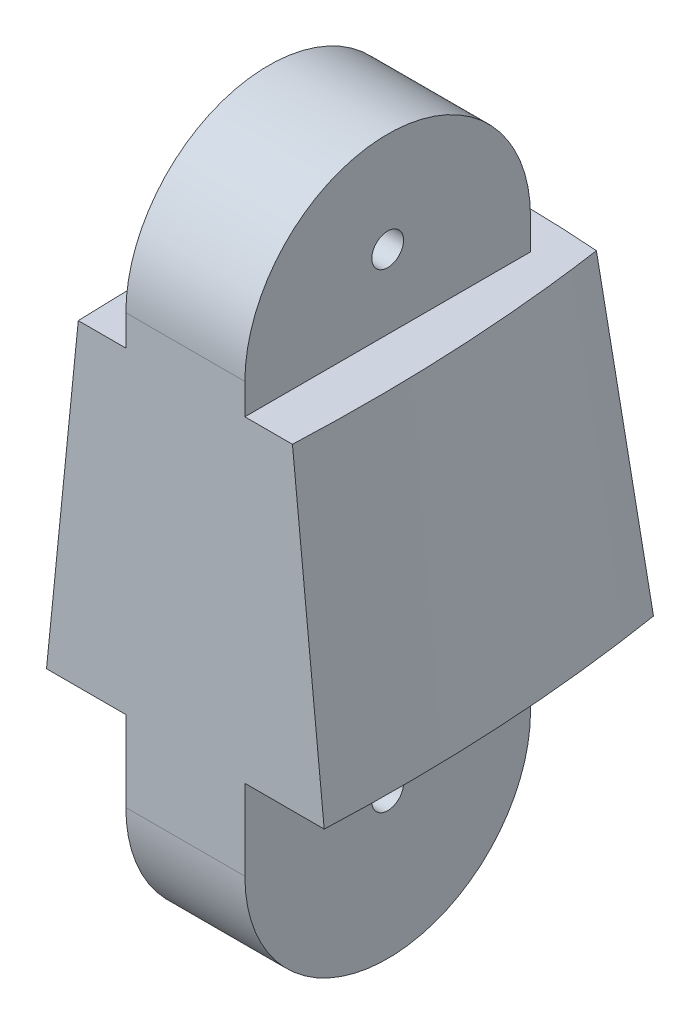
ISO-10303-21;
HEADER;
FILE_DESCRIPTION(('STEP AP214'),'2;1');
FILE_NAME('part.step','',(''),(''),'','','');
FILE_SCHEMA(('AUTOMOTIVE_DESIGN { 1 0 10303 214 1 1 1 1 }'));
ENDSEC;
DATA;
#1=APPLICATION_CONTEXT('core data for automotive mechanical design processes');
#2=APPLICATION_PROTOCOL_DEFINITION('international standard','automotive_design',2000,#1);
#3=PRODUCT_CONTEXT('',#1,'mechanical');
#4=PRODUCT('Part','Part','',(#3));
#5=PRODUCT_RELATED_PRODUCT_CATEGORY('part','',(#4));
#6=PRODUCT_DEFINITION_FORMATION('','',#4);
#7=PRODUCT_DEFINITION_CONTEXT('part definition',#1,'design');
#8=PRODUCT_DEFINITION('design','',#6,#7);
#9=PRODUCT_DEFINITION_SHAPE('','',#8);
#10=(LENGTH_UNIT() NAMED_UNIT(*) SI_UNIT(.MILLI.,.METRE.));
#11=(NAMED_UNIT(*) PLANE_ANGLE_UNIT() SI_UNIT($,.RADIAN.));
#12=(NAMED_UNIT(*) SI_UNIT($,.STERADIAN.) SOLID_ANGLE_UNIT());
#13=UNCERTAINTY_MEASURE_WITH_UNIT(LENGTH_MEASURE(1.E-05),#10,'distance_accuracy_value','');
#14=(GEOMETRIC_REPRESENTATION_CONTEXT(3) GLOBAL_UNCERTAINTY_ASSIGNED_CONTEXT((#13)) GLOBAL_UNIT_ASSIGNED_CONTEXT((#10,
#11,#12)) REPRESENTATION_CONTEXT('',''));
#15=CARTESIAN_POINT('',(0.,0.,0.));
#16=DIRECTION('',(0.,0.,1.));
#17=DIRECTION('',(1.,0.,0.));
#18=AXIS2_PLACEMENT_3D('',#15,#16,#17);
#19=CARTESIAN_POINT('',(0.,0.,-10.5150664920274));
#20=DIRECTION('',(0.,1.,0.));
#21=DIRECTION('',(0.,0.,1.));
#22=AXIS2_PLACEMENT_3D('',#19,#20,#21);
#23=PLANE('',#22);
#24=CARTESIAN_POINT('',(-8.75,0.,11.8461538461538));
#25=CARTESIAN_POINT('',(0.,0.,11.8461538461538));
#26=CARTESIAN_POINT('',(8.75,0.,11.8461538461538));
#27=B_SPLINE_CURVE_WITH_KNOTS('',2,(#24,#25,#26),.UNSPECIFIED.,.F.,.F.,(3,3),(0.,1.),.UNSPECIFIED.);
#28=CARTESIAN_POINT('',(3.75,0.,11.8461538461455));
#29=VERTEX_POINT('',#28);
#30=CARTESIAN_POINT('',(8.75,0.,11.8461538461538));
#31=VERTEX_POINT('',#30);
#32=EDGE_CURVE('E124',#29,#31,#27,.T.);
#33=ORIENTED_EDGE('',*,*,#32,.F.);
#34=DIRECTION('',(0.,0.,-1.));
#35=VECTOR('',#34,1.);
#36=CARTESIAN_POINT('',(3.75,0.,-10.5150664920274));
#37=LINE('',#36,#35);
#38=CARTESIAN_POINT('',(3.75,0.,-6.15384615384616));
#39=VERTEX_POINT('',#38);
#40=EDGE_CURVE('E138',#29,#39,#37,.T.);
#41=ORIENTED_EDGE('',*,*,#40,.T.);
#42=DIRECTION('',(1.,0.,0.));
#43=VECTOR('',#42,1.);
#44=CARTESIAN_POINT('',(0.,0.,-6.15384615384616));
#45=LINE('',#44,#43);
#46=CARTESIAN_POINT('',(-3.75,0.,-6.15384615384616));
#47=VERTEX_POINT('',#46);
#48=EDGE_CURVE('E570',#47,#39,#45,.T.);
#49=ORIENTED_EDGE('',*,*,#48,.F.);
#50=DIRECTION('',(0.,0.,-1.));
#51=VECTOR('',#50,1.);
#52=CARTESIAN_POINT('',(-3.75,0.,-10.5150664920274));
#53=LINE('',#52,#51);
#54=CARTESIAN_POINT('',(-3.75,0.,11.846153846133));
#55=VERTEX_POINT('',#54);
#56=EDGE_CURVE('E241',#55,#47,#53,.T.);
#57=ORIENTED_EDGE('',*,*,#56,.F.);
#58=CARTESIAN_POINT('',(-8.75,0.,11.8461538461538));
#59=VERTEX_POINT('',#58);
#60=EDGE_CURVE('E298',#59,#55,#27,.T.);
#61=ORIENTED_EDGE('',*,*,#60,.F.);
#62=CARTESIAN_POINT('',(-7.5,0.,-10.1538461538461));
#63=CARTESIAN_POINT('',(-9.2203932258797,0.,0.545261229815072));
#64=CARTESIAN_POINT('',(-8.75,0.,11.8461538461538));
#65=B_SPLINE_CURVE_WITH_KNOTS('',2,(#62,#63,#64),.UNSPECIFIED.,.F.,.F.,(3,3),(0.,1.),.UNSPECIFIED.);
#66=CARTESIAN_POINT('',(-7.5,0.,-10.1538461538461));
#67=VERTEX_POINT('',#66);
#68=EDGE_CURVE('E130',#67,#59,#65,.T.);
#69=ORIENTED_EDGE('',*,*,#68,.F.);
#70=CARTESIAN_POINT('',(7.5,0.,-10.1538461538461));
#71=CARTESIAN_POINT('',(0.,0.,-10.8762868302087));
#72=CARTESIAN_POINT('',(-7.5,0.,-10.1538461538461));
#73=B_SPLINE_CURVE_WITH_KNOTS('',2,(#70,#71,#72),.UNSPECIFIED.,.F.,.F.,(3,3),(0.,1.),.UNSPECIFIED.);
#74=CARTESIAN_POINT('',(7.5,0.,-10.1538461538461));
#75=VERTEX_POINT('',#74);
#76=EDGE_CURVE('E372',#75,#67,#73,.T.);
#77=ORIENTED_EDGE('',*,*,#76,.F.);
#78=CARTESIAN_POINT('',(8.75,0.,11.8461538461538));
#79=CARTESIAN_POINT('',(9.22039322587971,0.,0.54526122981507));
#80=CARTESIAN_POINT('',(7.5,0.,-10.1538461538461));
#81=B_SPLINE_CURVE_WITH_KNOTS('',2,(#78,#79,#80),.UNSPECIFIED.,.F.,.F.,(3,3),(0.,1.),.UNSPECIFIED.);
#82=EDGE_CURVE('E365',#31,#75,#81,.T.);
#83=ORIENTED_EDGE('',*,*,#82,.F.);
#84=EDGE_LOOP('',(#33,#41,#49,#57,#61,#69,#77,#83));
#85=FACE_BOUND('',#84,.T.);
#86=ADVANCED_FACE('F119',(#85),#23,.F.);
#87=CARTESIAN_POINT('',(-7.17393360621346,20.,-45.1690215571504));
#88=DIRECTION('',(0.,-1.,0.));
#89=DIRECTION('',(0.,0.,-1.));
#90=AXIS2_PLACEMENT_3D('',#87,#88,#89);
#91=PLANE('',#90);
#92=DIRECTION('',(-1.,0.,0.));
#93=VECTOR('',#92,1.);
#94=CARTESIAN_POINT('',(-7.17393360621346,20.,-6.15384615384615));
#95=LINE('',#94,#93);
#96=CARTESIAN_POINT('',(3.75,20.,-6.15384615384615));
#97=VERTEX_POINT('',#96);
#98=CARTESIAN_POINT('',(-3.75,20.,-6.15384615384616));
#99=VERTEX_POINT('',#98);
#100=EDGE_CURVE('E13',#97,#99,#95,.T.);
#101=ORIENTED_EDGE('',*,*,#100,.F.);
#102=DIRECTION('',(0.,0.,1.));
#103=VECTOR('',#102,1.);
#104=CARTESIAN_POINT('',(3.75,20.,-45.1690215571504));
#105=LINE('',#104,#103);
#106=CARTESIAN_POINT('',(3.75,20.,11.8461538461488));
#107=VERTEX_POINT('',#106);
#108=EDGE_CURVE('E280',#97,#107,#105,.T.);
#109=ORIENTED_EDGE('',*,*,#108,.T.);
#110=CARTESIAN_POINT('',(-8.75,20.,11.8461538461538));
#111=CARTESIAN_POINT('',(0.,20.,11.8461538461538));
#112=CARTESIAN_POINT('',(8.75,20.,11.8461538461538));
#113=B_SPLINE_CURVE_WITH_KNOTS('',2,(#110,#111,#112),.UNSPECIFIED.,.F.,.F.,(3,3),(0.,1.),.UNSPECIFIED.);
#114=CARTESIAN_POINT('',(6.74823833872554,20.,11.8461538461538));
#115=VERTEX_POINT('',#114);
#116=EDGE_CURVE('E218',#107,#115,#113,.T.);
#117=ORIENTED_EDGE('',*,*,#116,.T.);
#118=CARTESIAN_POINT('',(-2468.25612295644,20.,1686.28492565215));
#119=CARTESIAN_POINT('',(1169.14710624481,20.,-397.023938367836));
#120=CARTESIAN_POINT('',(621.959547383673,20.,-173.439589989387));
#121=CARTESIAN_POINT('',(-2962.45530677871,20.,-336.246513037687));
#122=B_SPLINE_CURVE_WITH_KNOTS('',3,(#118,#119,#120,#121),.UNSPECIFIED.,.F.,.F.,(4,4),
(-40.4829444596884,36.500435862339),.UNSPECIFIED.);
#123=CARTESIAN_POINT('',(5.76096322759435,20.,-8.29632819805975));
#124=VERTEX_POINT('',#123);
#125=EDGE_CURVE('E418',#115,#124,#122,.T.);
#126=ORIENTED_EDGE('',*,*,#125,.T.);
#127=CARTESIAN_POINT('',(5.76096322759391,20.,-8.29632819805979));
#128=CARTESIAN_POINT('',(1.91974228306342,20.,-8.58801218824814));
#129=CARTESIAN_POINT('',(-1.91974228306213,20.,-8.58801218824821));
#130=CARTESIAN_POINT('',(-5.76096322759262,20.,-8.29632819805992));
#131=B_SPLINE_CURVE_WITH_KNOTS('',3,(#127,#128,#129,#130),.UNSPECIFIED.,.F.,.F.,(4,4),(0.,1.),.UNSPECIFIED.);
#132=CARTESIAN_POINT('',(-5.760963227599,20.,-8.29632819803111));
#133=VERTEX_POINT('',#132);
#134=EDGE_CURVE('E435',#124,#133,#131,.T.);
#135=ORIENTED_EDGE('',*,*,#134,.T.);
#136=CARTESIAN_POINT('',(2962.38230705654,20.,-336.24319776774));
#137=CARTESIAN_POINT('',(-621.965937953665,20.,-173.442672386384));
#138=CARTESIAN_POINT('',(-1169.12209588683,20.,-397.009666203134));
#139=CARTESIAN_POINT('',(2468.25296066469,20.,1686.28311478494));
#140=B_SPLINE_CURVE_WITH_KNOTS('',3,(#136,#137,#138,#139),.UNSPECIFIED.,.F.,.F.,(4,4),
(-35.5004135536024,41.4824218446381),.UNSPECIFIED.);
#141=CARTESIAN_POINT('',(-6.74823833872717,20.,11.846153846109));
#142=VERTEX_POINT('',#141);
#143=EDGE_CURVE('E427',#133,#142,#140,.T.);
#144=ORIENTED_EDGE('',*,*,#143,.T.);
#145=CARTESIAN_POINT('',(-3.75,20.,11.8461538461538));
#146=VERTEX_POINT('',#145);
#147=EDGE_CURVE('E391',#142,#146,#113,.T.);
#148=ORIENTED_EDGE('',*,*,#147,.T.);
#149=DIRECTION('',(0.,0.,1.));
#150=VECTOR('',#149,1.);
#151=CARTESIAN_POINT('',(-3.75,20.,-45.1690215571504));
#152=LINE('',#151,#150);
#153=EDGE_CURVE('E237',#99,#146,#152,.T.);
#154=ORIENTED_EDGE('',*,*,#153,.F.);
#155=EDGE_LOOP('',(#101,#109,#117,#126,#135,#144,#148,#154));
#156=FACE_BOUND('',#155,.T.);
#157=ADVANCED_FACE('F333',(#156),#91,.F.);
#158=CARTESIAN_POINT('',(6.74823833872554,20.,11.8461538461538));
#159=DIRECTION('',(-3.33346653535284E-12,-3.33640275480538E-13,1.));
#160=DIRECTION('',(-1.,0.,-3.33346653535284E-12));
#161=AXIS2_PLACEMENT_3D('',#158,#159,#160);
#162=PLANE('',#161);
#163=ORIENTED_EDGE('',*,*,#116,.F.);
#164=DIRECTION('',(0.,-1.,0.));
#165=VECTOR('',#164,1.);
#166=CARTESIAN_POINT('',(3.75,21.9297869844279,11.8461538461538));
#167=LINE('',#166,#165);
#168=CARTESIAN_POINT('',(3.75,21.9297869844279,11.8461538461538));
#169=VERTEX_POINT('',#168);
#170=EDGE_CURVE('E211',#169,#107,#167,.T.);
#171=ORIENTED_EDGE('',*,*,#170,.F.);
#172=DIRECTION('',(-1.,0.,0.));
#173=VECTOR('',#172,1.);
#174=CARTESIAN_POINT('',(3.75,21.9297869844279,11.8461538461538));
#175=LINE('',#174,#173);
#176=CARTESIAN_POINT('',(-3.75,21.9297869844279,11.8461538461538));
#177=VERTEX_POINT('',#176);
#178=EDGE_CURVE('E215',#169,#177,#175,.T.);
#179=ORIENTED_EDGE('',*,*,#178,.T.);
#180=DIRECTION('',(0.,-1.,0.));
#181=VECTOR('',#180,1.);
#182=CARTESIAN_POINT('',(-3.75,21.9297869844279,11.8461538461538));
#183=LINE('',#182,#181);
#184=EDGE_CURVE('E248',#177,#146,#183,.T.);
#185=ORIENTED_EDGE('',*,*,#184,.T.);
#186=ORIENTED_EDGE('',*,*,#147,.F.);
#187=CARTESIAN_POINT('',(-6.74823833872709,20.,11.8461538461088));
#188=CARTESIAN_POINT('',(-7.41549222581806,13.3333333333333,11.8461538461238));
#189=CARTESIAN_POINT('',(-8.08274611290903,6.66666666666666,11.8461538461388));
#190=CARTESIAN_POINT('',(-8.75,0.,11.8461538461538));
#191=B_SPLINE_CURVE_WITH_KNOTS('',3,(#187,#188,#189,#190),.UNSPECIFIED.,.F.,.F.,(4,4),(0.,1.),.UNSPECIFIED.);
#192=EDGE_CURVE('E542',#142,#59,#191,.T.);
#193=ORIENTED_EDGE('',*,*,#192,.T.);
#194=ORIENTED_EDGE('',*,*,#60,.T.);
#195=CARTESIAN_POINT('',(-3.75,-5.07021301557208,11.8461538461538));
#196=VERTEX_POINT('',#195);
#197=EDGE_CURVE('E252',#55,#196,#183,.T.);
#198=ORIENTED_EDGE('',*,*,#197,.T.);
#199=DIRECTION('',(-1.,0.,0.));
#200=VECTOR('',#199,1.);
#201=CARTESIAN_POINT('',(3.75,-5.07021301557208,11.8461538461538));
#202=LINE('',#201,#200);
#203=CARTESIAN_POINT('',(3.75,-5.07021301557208,11.8461538461538));
#204=VERTEX_POINT('',#203);
#205=EDGE_CURVE('E238',#204,#196,#202,.T.);
#206=ORIENTED_EDGE('',*,*,#205,.F.);
#207=EDGE_CURVE('E222',#29,#204,#167,.T.);
#208=ORIENTED_EDGE('',*,*,#207,.F.);
#209=ORIENTED_EDGE('',*,*,#32,.T.);
#210=CARTESIAN_POINT('',(6.74823833872554,20.,11.8461538461538));
#211=CARTESIAN_POINT('',(7.41549222581703,13.3333333333333,11.8461538461538));
#212=CARTESIAN_POINT('',(8.08274611290851,6.66666666666667,11.8461538461538));
#213=CARTESIAN_POINT('',(8.75,0.,11.8461538461538));
#214=B_SPLINE_CURVE_WITH_KNOTS('',3,(#210,#211,#212,#213),.UNSPECIFIED.,.F.,.F.,(4,4),(0.,1.),.UNSPECIFIED.);
#215=EDGE_CURVE('E539',#115,#31,#214,.T.);
#216=ORIENTED_EDGE('',*,*,#215,.F.);
#217=EDGE_LOOP('',(#163,#171,#179,#185,#186,#193,#194,#198,#206,#208,#209,#216));
#218=FACE_BOUND('',#217,.T.);
#219=ADVANCED_FACE('F121',(#218),#162,.T.);
#220=CARTESIAN_POINT('',(5.76096322759435,20.,-8.29632819805975));
#221=CARTESIAN_POINT('',(6.34064215172957,13.3333333333333,-8.91550084998855));
#222=CARTESIAN_POINT('',(6.92032107586478,6.66666666666667,-9.53467350191735));
#223=CARTESIAN_POINT('',(7.5,0.,-10.1538461538461));
#224=CARTESIAN_POINT('',(5.99826518480455,20.,-6.66208337973978));
#225=CARTESIAN_POINT('',(6.59442085797413,13.3333333333333,-7.23160944979406));
#226=CARTESIAN_POINT('',(7.19057653114371,6.66666666666667,-7.80113551984834));
#227=CARTESIAN_POINT('',(7.78673220431328,0.,-8.37066158990261));
#228=CARTESIAN_POINT('',(6.39546064325868,20.,-3.37169502818409));
#229=CARTESIAN_POINT('',(7.01994504354463,13.3333333333333,-3.84086937789628));
#230=CARTESIAN_POINT('',(7.64442944383058,6.66666666666666,-4.31004372760846));
#231=CARTESIAN_POINT('',(8.26891384411653,0.,-4.77921807732064));
#232=CARTESIAN_POINT('',(6.75878982877219,20.,1.63014380637131));
#233=CARTESIAN_POINT('',(7.41197255163197,13.3333333333333,1.31448598612654));
#234=CARTESIAN_POINT('',(8.06515527449175,6.66666666666667,0.998828165881778));
#235=CARTESIAN_POINT('',(8.71833799735153,0.,0.683170345637011));
#236=CARTESIAN_POINT('',(6.88941637784931,20.,6.69879911062324));
#237=CARTESIAN_POINT('',(7.55758219993838,13.3333333333333,6.53946004797527));
#238=CARTESIAN_POINT('',(8.22574802202746,6.66666666666667,6.38012098532731));
#239=CARTESIAN_POINT('',(8.89391384411653,0.,6.22078192267935));
#240=CARTESIAN_POINT('',(6.82120656343057,20.,10.1228204015719));
#241=CARTESIAN_POINT('',(7.49027066594703,13.3333333333333,10.0694375155249));
#242=CARTESIAN_POINT('',(8.15933476846349,6.66666666666667,10.0160546294778));
#243=CARTESIAN_POINT('',(8.82839887097995,0.,9.96267174343071));
#244=CARTESIAN_POINT('',(6.74823833872554,20.,11.8461538461538));
#245=CARTESIAN_POINT('',(7.41549222581703,13.3333333333333,11.8461538461538));
#246=CARTESIAN_POINT('',(8.08274611290851,6.66666666666667,11.8461538461538));
#247=CARTESIAN_POINT('',(8.75,0.,11.8461538461538));
#248=B_SPLINE_SURFACE_WITH_KNOTS('',3,3,((#220,#221,#222,#223),(#224,#225,#226,#227),(#228,#229,
#230,#231),(#232,#233,#234,#235),(#236,#237,#238,#239),(#240,#241,#242,#243),(#244,#245,#246,
#247)),.UNSPECIFIED.,.F.,.F.,.F.,(4,1,1,1,4),(4,4),(0.484420366691908,0.558995874922004,
0.6335713831521,0.708146891382196,0.782722399612291),(0.,1.),.UNSPECIFIED.);
#249=CARTESIAN_POINT('',(5.76096322759435,20.,-8.29632819805975));
#250=CARTESIAN_POINT('',(6.34064215172957,13.3333333333333,-8.91550084998855));
#251=CARTESIAN_POINT('',(6.92032107586478,6.66666666666667,-9.53467350191735));
#252=CARTESIAN_POINT('',(7.5,0.,-10.1538461538461));
#253=B_SPLINE_CURVE_WITH_KNOTS('',3,(#249,#250,#251,#252),.UNSPECIFIED.,.F.,.F.,(4,4),(0.,1.),.UNSPECIFIED.);
#254=EDGE_CURVE('E538',#124,#75,#253,.T.);
#255=ORIENTED_EDGE('',*,*,#125,.F.);
#256=ORIENTED_EDGE('',*,*,#215,.T.);
#257=ORIENTED_EDGE('',*,*,#82,.T.);
#258=ORIENTED_EDGE('',*,*,#254,.F.);
#259=EDGE_LOOP('',(#255,#256,#257,#258));
#260=FACE_BOUND('',#259,.T.);
#261=ADVANCED_FACE('F340',(#260),#248,.T.);
#262=CARTESIAN_POINT('',(-5.76096322759262,20.,-8.29632819805992));
#263=CARTESIAN_POINT('',(-6.34064215172841,13.3333333333333,-8.91550084998867));
#264=CARTESIAN_POINT('',(-6.92032107586421,6.66666666666667,-9.53467350191741));
#265=CARTESIAN_POINT('',(-7.5,0.,-10.1538461538461));
#266=CARTESIAN_POINT('',(-4.80065799146,20.,-8.369249195607));
#267=CARTESIAN_POINT('',(-5.28377199430666,13.3333333333333,-9.00425044148463));
#268=CARTESIAN_POINT('',(-5.76688599715333,6.66666666666667,-9.63925168736227));
#269=CARTESIAN_POINT('',(-6.25,0.,-10.2742529332399));
#270=CARTESIAN_POINT('',(-2.88026456649537,20.,-8.47863069192761));
#271=CARTESIAN_POINT('',(-3.17017637766358,13.3333333333333,-9.13737482872859));
#272=CARTESIAN_POINT('',(-3.46008818883179,6.66666666666666,-9.79611896552958));
#273=CARTESIAN_POINT('',(-3.75,0.,-10.4548631023306));
#274=CARTESIAN_POINT('',(6.46618175670355E-13,20.,-8.53332144008785));
#275=CARTESIAN_POINT('',(4.30211422042248E-13,13.3333333333333,-9.20393702235052));
#276=CARTESIAN_POINT('',(2.13804668414141E-13,6.66666666666667,-9.87455260461319));
#277=CARTESIAN_POINT('',(0.,0.,-10.5451681868759));
#278=CARTESIAN_POINT('',(2.88026456649667,20.,-8.47863069192752));
#279=CARTESIAN_POINT('',(3.17017637766444,13.3333333333333,-9.13737482872854));
#280=CARTESIAN_POINT('',(3.46008818883222,6.66666666666666,-9.79611896552955));
#281=CARTESIAN_POINT('',(3.75,0.,-10.4548631023306));
#282=CARTESIAN_POINT('',(4.80065799146129,20.,-8.36924919560688));
#283=CARTESIAN_POINT('',(5.28377199430753,13.3333333333333,-9.00425044148455));
#284=CARTESIAN_POINT('',(5.76688599715377,6.66666666666667,-9.63925168736223));
#285=CARTESIAN_POINT('',(6.25,0.,-10.2742529332399));
#286=CARTESIAN_POINT('',(5.76096322759435,20.,-8.29632819805975));
#287=CARTESIAN_POINT('',(6.34064215172957,13.3333333333333,-8.91550084998855));
#288=CARTESIAN_POINT('',(6.92032107586478,6.66666666666667,-9.53467350191735));
#289=CARTESIAN_POINT('',(7.5,0.,-10.1538461538461));
#290=B_SPLINE_SURFACE_WITH_KNOTS('',3,3,((#262,#263,#264,#265),(#266,#267,#268,#269),(#270,#271,
#272,#273),(#274,#275,#276,#277),(#278,#279,#280,#281),(#282,#283,#284,#285),(#286,#287,#288,
#289)),.UNSPECIFIED.,.F.,.F.,.F.,(4,1,1,1,4),(4,4),(0.298302032919818,0.344831616362841,
0.391361199805863,0.437890783248886,0.484420366691908),(0.,1.),.UNSPECIFIED.);
#291=CARTESIAN_POINT('',(-5.76096322759262,20.,-8.29632819805992));
#292=CARTESIAN_POINT('',(-6.34064215172841,13.3333333333333,-8.91550084998867));
#293=CARTESIAN_POINT('',(-6.92032107586421,6.66666666666667,-9.53467350191741));
#294=CARTESIAN_POINT('',(-7.5,0.,-10.1538461538461));
#295=B_SPLINE_CURVE_WITH_KNOTS('',3,(#291,#292,#293,#294),.UNSPECIFIED.,.F.,.F.,(4,4),(0.,1.),.UNSPECIFIED.);
#296=EDGE_CURVE('E434',#133,#67,#295,.T.);
#297=ORIENTED_EDGE('',*,*,#134,.F.);
#298=ORIENTED_EDGE('',*,*,#254,.T.);
#299=ORIENTED_EDGE('',*,*,#76,.T.);
#300=ORIENTED_EDGE('',*,*,#296,.F.);
#301=EDGE_LOOP('',(#297,#298,#299,#300));
#302=FACE_BOUND('',#301,.T.);
#303=ADVANCED_FACE('F496',(#302),#290,.T.);
#304=CARTESIAN_POINT('',(-6.74823833872709,20.,11.8461538461088));
#305=CARTESIAN_POINT('',(-7.41549222581806,13.3333333333333,11.8461538461238));
#306=CARTESIAN_POINT('',(-8.08274611290903,6.66666666666666,11.8461538461388));
#307=CARTESIAN_POINT('',(-8.75,0.,11.8461538461538));
#308=CARTESIAN_POINT('',(-6.82120656343122,20.,10.1228204015331));
#309=CARTESIAN_POINT('',(-7.49027066594746,13.3333333333333,10.0694375154989));
#310=CARTESIAN_POINT('',(-8.15933476846371,6.66666666666666,10.0160546294648));
#311=CARTESIAN_POINT('',(-8.82839887097995,0.,9.96267174343071));
#312=CARTESIAN_POINT('',(-6.88941637784881,20.,6.69879911059696));
#313=CARTESIAN_POINT('',(-7.55758219993804,13.3333333333333,6.53946004795776));
#314=CARTESIAN_POINT('',(-8.22574802202728,6.66666666666667,6.38012098531856));
#315=CARTESIAN_POINT('',(-8.89391384411652,0.,6.22078192267936));
#316=CARTESIAN_POINT('',(-6.75878982877174,20.,1.63014380636403));
#317=CARTESIAN_POINT('',(-7.41197255163167,13.3333333333333,1.31448598612169));
#318=CARTESIAN_POINT('',(-8.0651552744916,6.66666666666667,0.998828165879351));
#319=CARTESIAN_POINT('',(-8.71833799735154,0.,0.683170345637012));
#320=CARTESIAN_POINT('',(-6.3954606432599,20.,-3.37169502817285));
#321=CARTESIAN_POINT('',(-7.01994504354544,13.3333333333333,-3.84086937788878));
#322=CARTESIAN_POINT('',(-7.64442944383098,6.66666666666666,-4.31004372760471));
#323=CARTESIAN_POINT('',(-8.26891384411652,0.,-4.77921807732064));
#324=CARTESIAN_POINT('',(-5.99826518480786,20.,-6.66208337971686));
#325=CARTESIAN_POINT('',(-6.59442085797633,13.3333333333333,-7.23160944977878));
#326=CARTESIAN_POINT('',(-7.19057653114481,6.66666666666667,-7.80113551984069));
#327=CARTESIAN_POINT('',(-7.78673220431328,0.,-8.37066158990261));
#328=CARTESIAN_POINT('',(-5.76096322759262,20.,-8.29632819805992));
#329=CARTESIAN_POINT('',(-6.34064215172841,13.3333333333333,-8.91550084998867));
#330=CARTESIAN_POINT('',(-6.92032107586421,6.66666666666667,-9.53467350191741));
#331=CARTESIAN_POINT('',(-7.5,0.,-10.1538461538461));
#332=B_SPLINE_SURFACE_WITH_KNOTS('',3,3,((#304,#305,#306,#307),(#308,#309,#310,#311),(#312,#313,
#314,#315),(#316,#317,#318,#319),(#320,#321,#322,#323),(#324,#325,#326,#327),(#328,#329,#330,
#331)),.UNSPECIFIED.,.F.,.F.,.F.,(4,1,1,1,4),(4,4),(0.,0.0745755082299546,0.149151016459909,
0.223726524689864,0.298302032919818),(0.,1.),.UNSPECIFIED.);
#333=ORIENTED_EDGE('',*,*,#143,.F.);
#334=ORIENTED_EDGE('',*,*,#296,.T.);
#335=ORIENTED_EDGE('',*,*,#68,.T.);
#336=ORIENTED_EDGE('',*,*,#192,.F.);
#337=EDGE_LOOP('',(#333,#334,#335,#336));
#338=FACE_BOUND('',#337,.T.);
#339=ADVANCED_FACE('F488',(#338),#332,.T.);
#340=CARTESIAN_POINT('',(3.75,21.9297869844279,2.84615384615384));
#341=DIRECTION('',(-1.,0.,0.));
#342=DIRECTION('',(0.,0.,1.));
#343=AXIS2_PLACEMENT_3D('',#340,#341,#342);
#344=CYLINDRICAL_SURFACE('',#343,8.99999999999999);
#345=CARTESIAN_POINT('',(-3.75,21.9297869844279,2.84615384615384));
#346=DIRECTION('',(1.,0.,0.));
#347=DIRECTION('',(0.,0.,-1.));
#348=AXIS2_PLACEMENT_3D('',#345,#346,#347);
#349=CIRCLE('',#348,8.99999999999999);
#350=CARTESIAN_POINT('',(-3.75,21.9297869844279,-6.15384615384615));
#351=VERTEX_POINT('',#350);
#352=EDGE_CURVE('E236',#351,#177,#349,.T.);
#353=ORIENTED_EDGE('',*,*,#352,.T.);
#354=ORIENTED_EDGE('',*,*,#178,.F.);
#355=CARTESIAN_POINT('',(3.75,21.9297869844279,2.84615384615384));
#356=DIRECTION('',(1.,0.,0.));
#357=DIRECTION('',(0.,0.,-1.));
#358=AXIS2_PLACEMENT_3D('',#355,#356,#357);
#359=CIRCLE('',#358,8.99999999999999);
#360=CARTESIAN_POINT('',(3.75,21.9297869844279,-6.15384615384615));
#361=VERTEX_POINT('',#360);
#362=EDGE_CURVE('E225',#361,#169,#359,.T.);
#363=ORIENTED_EDGE('',*,*,#362,.F.);
#364=DIRECTION('',(-1.,0.,0.));
#365=VECTOR('',#364,1.);
#366=CARTESIAN_POINT('',(3.75,21.9297869844279,-6.15384615384615));
#367=LINE('',#366,#365);
#368=EDGE_CURVE('E262',#361,#351,#367,.T.);
#369=ORIENTED_EDGE('',*,*,#368,.T.);
#370=EDGE_LOOP('',(#353,#354,#363,#369));
#371=FACE_BOUND('',#370,.T.);
#372=ADVANCED_FACE('F234',(#371),#344,.T.);
#373=CARTESIAN_POINT('',(-3.75,21.9297869844279,2.84615384615384));
#374=DIRECTION('',(1.,0.,0.));
#375=DIRECTION('',(0.,0.,-1.));
#376=AXIS2_PLACEMENT_3D('',#373,#374,#375);
#377=PLANE('',#376);
#378=CARTESIAN_POINT('',(-3.75,24.6403128220649,2.84615384615385));
#379=DIRECTION('',(1.,0.,0.));
#380=DIRECTION('',(0.,0.,-1.));
#381=AXIS2_PLACEMENT_3D('',#378,#379,#380);
#382=CIRCLE('',#381,0.999999999999999);
#383=CARTESIAN_POINT('',(-3.75,24.6403128220649,1.84615384615385));
#384=VERTEX_POINT('',#383);
#385=EDGE_CURVE('E306',#384,#384,#382,.T.);
#386=ORIENTED_EDGE('',*,*,#385,.T.);
#387=EDGE_LOOP('',(#386));
#388=FACE_BOUND('',#387,.T.);
#389=DIRECTION('',(0.,1.,0.));
#390=VECTOR('',#389,1.);
#391=CARTESIAN_POINT('',(-3.75,21.9297869844279,-6.15384615384615));
#392=LINE('',#391,#390);
#393=EDGE_CURVE('E259',#99,#351,#392,.T.);
#394=ORIENTED_EDGE('',*,*,#393,.F.);
#395=ORIENTED_EDGE('',*,*,#153,.T.);
#396=ORIENTED_EDGE('',*,*,#184,.F.);
#397=ORIENTED_EDGE('',*,*,#352,.F.);
#398=EDGE_LOOP('',(#394,#395,#396,#397));
#399=FACE_BOUND('',#398,.T.);
#400=ADVANCED_FACE('F319',(#388,#399),#377,.F.);
#401=CARTESIAN_POINT('',(3.75,21.9297869844279,2.84615384615384));
#402=DIRECTION('',(1.,0.,0.));
#403=DIRECTION('',(0.,0.,-1.));
#404=AXIS2_PLACEMENT_3D('',#401,#402,#403);
#405=PLANE('',#404);
#406=CARTESIAN_POINT('',(3.75,24.6403128220649,2.84615384615385));
#407=DIRECTION('',(1.,0.,0.));
#408=DIRECTION('',(0.,0.,-1.));
#409=AXIS2_PLACEMENT_3D('',#406,#407,#408);
#410=CIRCLE('',#409,1.);
#411=CARTESIAN_POINT('',(3.75,24.6403128220649,1.84615384615384));
#412=VERTEX_POINT('',#411);
#413=EDGE_CURVE('E311',#412,#412,#410,.T.);
#414=ORIENTED_EDGE('',*,*,#413,.F.);
#415=EDGE_LOOP('',(#414));
#416=FACE_BOUND('',#415,.T.);
#417=ORIENTED_EDGE('',*,*,#108,.F.);
#418=DIRECTION('',(0.,1.,0.));
#419=VECTOR('',#418,1.);
#420=CARTESIAN_POINT('',(3.75,21.9297869844279,-6.15384615384615));
#421=LINE('',#420,#419);
#422=EDGE_CURVE('E228',#97,#361,#421,.T.);
#423=ORIENTED_EDGE('',*,*,#422,.T.);
#424=ORIENTED_EDGE('',*,*,#362,.T.);
#425=ORIENTED_EDGE('',*,*,#170,.T.);
#426=EDGE_LOOP('',(#417,#423,#424,#425));
#427=FACE_BOUND('',#426,.T.);
#428=ADVANCED_FACE('F226',(#416,#427),#405,.T.);
#429=CARTESIAN_POINT('',(3.75,21.9297869844279,-6.15384615384615));
#430=DIRECTION('',(0.,0.,1.));
#431=DIRECTION('',(0.,-1.,0.));
#432=AXIS2_PLACEMENT_3D('',#429,#430,#431);
#433=PLANE('',#432);
#434=ORIENTED_EDGE('',*,*,#422,.F.);
#435=ORIENTED_EDGE('',*,*,#100,.T.);
#436=ORIENTED_EDGE('',*,*,#393,.T.);
#437=ORIENTED_EDGE('',*,*,#368,.F.);
#438=EDGE_LOOP('',(#434,#435,#436,#437));
#439=FACE_BOUND('',#438,.T.);
#440=ADVANCED_FACE('F318',(#439),#433,.F.);
#441=CARTESIAN_POINT('',(-3.75,-5.07021301557208,-6.15384615384616));
#442=VERTEX_POINT('',#441);
#443=EDGE_CURVE('E232',#442,#47,#392,.T.);
#444=ORIENTED_EDGE('',*,*,#443,.T.);
#445=ORIENTED_EDGE('',*,*,#48,.T.);
#446=CARTESIAN_POINT('',(3.75,-5.07021301557208,-6.15384615384616));
#447=VERTEX_POINT('',#446);
#448=EDGE_CURVE('E263',#447,#39,#421,.T.);
#449=ORIENTED_EDGE('',*,*,#448,.F.);
#450=DIRECTION('',(-1.,0.,0.));
#451=VECTOR('',#450,1.);
#452=CARTESIAN_POINT('',(3.75,-5.07021301557208,-6.15384615384616));
#453=LINE('',#452,#451);
#454=EDGE_CURVE('E244',#447,#442,#453,.T.);
#455=ORIENTED_EDGE('',*,*,#454,.T.);
#456=EDGE_LOOP('',(#444,#445,#449,#455));
#457=FACE_BOUND('',#456,.T.);
#458=ADVANCED_FACE('F269',(#457),#433,.F.);
#459=CARTESIAN_POINT('',(3.75,-4.99503248545199,2.84615384615384));
#460=DIRECTION('',(1.,0.,0.));
#461=DIRECTION('',(0.,0.,-1.));
#462=AXIS2_PLACEMENT_3D('',#459,#460,#461);
#463=CIRCLE('',#462,0.999999999999999);
#464=CARTESIAN_POINT('',(3.75,-4.99503248545199,1.84615384615384));
#465=VERTEX_POINT('',#464);
#466=EDGE_CURVE('E302',#465,#465,#463,.T.);
#467=ORIENTED_EDGE('',*,*,#466,.F.);
#468=EDGE_LOOP('',(#467));
#469=FACE_BOUND('',#468,.T.);
#470=ORIENTED_EDGE('',*,*,#40,.F.);
#471=ORIENTED_EDGE('',*,*,#207,.T.);
#472=CARTESIAN_POINT('',(3.75,-5.07021301557208,2.84615384615384));
#473=DIRECTION('',(1.,0.,0.));
#474=DIRECTION('',(0.,0.,-1.));
#475=AXIS2_PLACEMENT_3D('',#472,#473,#474);
#476=CIRCLE('',#475,9.);
#477=EDGE_CURVE('E221',#204,#447,#476,.T.);
#478=ORIENTED_EDGE('',*,*,#477,.T.);
#479=ORIENTED_EDGE('',*,*,#448,.T.);
#480=EDGE_LOOP('',(#470,#471,#478,#479));
#481=FACE_BOUND('',#480,.T.);
#482=ADVANCED_FACE('F294',(#469,#481),#405,.T.);
#483=CARTESIAN_POINT('',(-3.75,-4.99503248545199,2.84615384615384));
#484=DIRECTION('',(1.,0.,0.));
#485=DIRECTION('',(0.,0.,-1.));
#486=AXIS2_PLACEMENT_3D('',#483,#484,#485);
#487=CIRCLE('',#486,0.999999999999999);
#488=CARTESIAN_POINT('',(-3.75,-4.99503248545199,1.84615384615384));
#489=VERTEX_POINT('',#488);
#490=EDGE_CURVE('E300',#489,#489,#487,.T.);
#491=ORIENTED_EDGE('',*,*,#490,.T.);
#492=EDGE_LOOP('',(#491));
#493=FACE_BOUND('',#492,.T.);
#494=ORIENTED_EDGE('',*,*,#197,.F.);
#495=ORIENTED_EDGE('',*,*,#56,.T.);
#496=ORIENTED_EDGE('',*,*,#443,.F.);
#497=CARTESIAN_POINT('',(-3.75,-5.07021301557208,2.84615384615384));
#498=DIRECTION('',(1.,0.,0.));
#499=DIRECTION('',(0.,0.,-1.));
#500=AXIS2_PLACEMENT_3D('',#497,#498,#499);
#501=CIRCLE('',#500,9.);
#502=EDGE_CURVE('E251',#196,#442,#501,.T.);
#503=ORIENTED_EDGE('',*,*,#502,.F.);
#504=EDGE_LOOP('',(#494,#495,#496,#503));
#505=FACE_BOUND('',#504,.T.);
#506=ADVANCED_FACE('F277',(#493,#505),#377,.F.);
#507=CARTESIAN_POINT('',(3.75,-5.07021301557208,2.84615384615384));
#508=DIRECTION('',(-1.,0.,0.));
#509=DIRECTION('',(0.,0.,1.));
#510=AXIS2_PLACEMENT_3D('',#507,#508,#509);
#511=CYLINDRICAL_SURFACE('',#510,9.);
#512=ORIENTED_EDGE('',*,*,#502,.T.);
#513=ORIENTED_EDGE('',*,*,#454,.F.);
#514=ORIENTED_EDGE('',*,*,#477,.F.);
#515=ORIENTED_EDGE('',*,*,#205,.T.);
#516=EDGE_LOOP('',(#512,#513,#514,#515));
#517=FACE_BOUND('',#516,.T.);
#518=ADVANCED_FACE('F297',(#517),#511,.T.);
#519=CARTESIAN_POINT('',(3.75,-4.99503248545199,2.84615384615384));
#520=DIRECTION('',(1.,0.,0.));
#521=DIRECTION('',(0.,0.,-1.));
#522=AXIS2_PLACEMENT_3D('',#519,#520,#521);
#523=CYLINDRICAL_SURFACE('',#522,0.999999999999999);
#524=ORIENTED_EDGE('',*,*,#490,.F.);
#525=EDGE_LOOP('',(#524));
#526=FACE_BOUND('',#525,.T.);
#527=ORIENTED_EDGE('',*,*,#466,.T.);
#528=EDGE_LOOP('',(#527));
#529=FACE_BOUND('',#528,.T.);
#530=ADVANCED_FACE('F722',(#526,#529),#523,.F.);
#531=CARTESIAN_POINT('',(3.75,24.6403128220649,2.84615384615385));
#532=DIRECTION('',(1.,0.,0.));
#533=DIRECTION('',(0.,0.,-1.));
#534=AXIS2_PLACEMENT_3D('',#531,#532,#533);
#535=CYLINDRICAL_SURFACE('',#534,0.999999999999999);
#536=ORIENTED_EDGE('',*,*,#385,.F.);
#537=EDGE_LOOP('',(#536));
#538=FACE_BOUND('',#537,.T.);
#539=ORIENTED_EDGE('',*,*,#413,.T.);
#540=EDGE_LOOP('',(#539));
#541=FACE_BOUND('',#540,.T.);
#542=ADVANCED_FACE('F315',(#538,#541),#535,.F.);
#543=CLOSED_SHELL('',(#86,#157,#219,#261,#303,#339,#372,#400,#428,#440,#458,#482,#506,#518,#530,#542));
#544=MANIFOLD_SOLID_BREP('B2',#543);
#545=ADVANCED_BREP_SHAPE_REPRESENTATION('',(#18,#544),#14);
#546=SHAPE_DEFINITION_REPRESENTATION(#9,#545);
ENDSEC;
END-ISO-10303-21;
